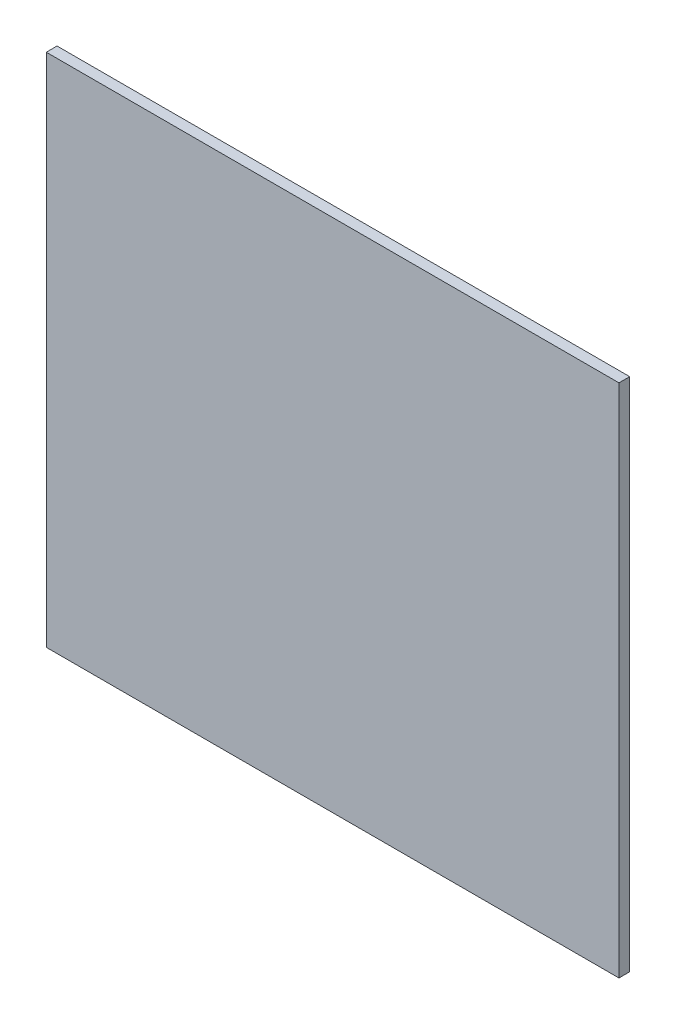
ISO-10303-21;
HEADER;
FILE_DESCRIPTION(('STEP AP214'),'2;1');
FILE_NAME('part.step','',(''),(''),'','','');
FILE_SCHEMA(('AUTOMOTIVE_DESIGN { 1 0 10303 214 1 1 1 1 }'));
ENDSEC;
DATA;
#1=APPLICATION_CONTEXT('core data for automotive mechanical design processes');
#2=APPLICATION_PROTOCOL_DEFINITION('international standard','automotive_design',2000,#1);
#3=PRODUCT_CONTEXT('',#1,'mechanical');
#4=PRODUCT('Part','Part','',(#3));
#5=PRODUCT_RELATED_PRODUCT_CATEGORY('part','',(#4));
#6=PRODUCT_DEFINITION_FORMATION('','',#4);
#7=PRODUCT_DEFINITION_CONTEXT('part definition',#1,'design');
#8=PRODUCT_DEFINITION('design','',#6,#7);
#9=PRODUCT_DEFINITION_SHAPE('','',#8);
#10=(LENGTH_UNIT() NAMED_UNIT(*) SI_UNIT(.MILLI.,.METRE.));
#11=(NAMED_UNIT(*) PLANE_ANGLE_UNIT() SI_UNIT($,.RADIAN.));
#12=(NAMED_UNIT(*) SI_UNIT($,.STERADIAN.) SOLID_ANGLE_UNIT());
#13=UNCERTAINTY_MEASURE_WITH_UNIT(LENGTH_MEASURE(1.E-05),#10,'distance_accuracy_value','');
#14=(GEOMETRIC_REPRESENTATION_CONTEXT(3) GLOBAL_UNCERTAINTY_ASSIGNED_CONTEXT((#13)) GLOBAL_UNIT_ASSIGNED_CONTEXT((#10,
#11,#12)) REPRESENTATION_CONTEXT('',''));
#15=CARTESIAN_POINT('',(0.,0.,0.));
#16=DIRECTION('',(0.,0.,1.));
#17=DIRECTION('',(1.,0.,0.));
#18=AXIS2_PLACEMENT_3D('',#15,#16,#17);
#19=CARTESIAN_POINT('',(0.,914.4,-933.45));
#20=DIRECTION('',(1.,0.,0.));
#21=DIRECTION('',(0.,1.,0.));
#22=AXIS2_PLACEMENT_3D('',#19,#20,#21);
#23=PLANE('',#22);
#24=DIRECTION('',(0.,1.,0.));
#25=VECTOR('',#24,1.);
#26=CARTESIAN_POINT('',(0.,914.4,-914.4));
#27=LINE('',#26,#25);
#28=CARTESIAN_POINT('',(0.,0.,-914.4));
#29=VERTEX_POINT('',#28);
#30=CARTESIAN_POINT('',(0.,914.4,-914.4));
#31=VERTEX_POINT('',#30);
#32=EDGE_CURVE('E96',#29,#31,#27,.T.);
#33=ORIENTED_EDGE('',*,*,#32,.T.);
#34=DIRECTION('',(0.,0.,1.));
#35=VECTOR('',#34,1.);
#36=CARTESIAN_POINT('',(0.,914.4,-933.45));
#37=LINE('',#36,#35);
#38=CARTESIAN_POINT('',(0.,914.4,-933.45));
#39=VERTEX_POINT('',#38);
#40=EDGE_CURVE('E11',#39,#31,#37,.T.);
#41=ORIENTED_EDGE('',*,*,#40,.F.);
#42=DIRECTION('',(0.,1.,0.));
#43=VECTOR('',#42,1.);
#44=CARTESIAN_POINT('',(0.,914.4,-933.45));
#45=LINE('',#44,#43);
#46=CARTESIAN_POINT('',(0.,0.,-933.45));
#47=VERTEX_POINT('',#46);
#48=EDGE_CURVE('E84',#47,#39,#45,.T.);
#49=ORIENTED_EDGE('',*,*,#48,.F.);
#50=DIRECTION('',(0.,0.,1.));
#51=VECTOR('',#50,1.);
#52=CARTESIAN_POINT('',(0.,0.,-933.45));
#53=LINE('',#52,#51);
#54=EDGE_CURVE('E92',#47,#29,#53,.T.);
#55=ORIENTED_EDGE('',*,*,#54,.T.);
#56=EDGE_LOOP('',(#33,#41,#49,#55));
#57=FACE_BOUND('',#56,.T.);
#58=ADVANCED_FACE('F33',(#57),#23,.F.);
#59=CARTESIAN_POINT('',(1016.,914.4,-933.45));
#60=DIRECTION('',(0.,-1.,0.));
#61=DIRECTION('',(0.,0.,-1.));
#62=AXIS2_PLACEMENT_3D('',#59,#60,#61);
#63=PLANE('',#62);
#64=DIRECTION('',(1.,0.,0.));
#65=VECTOR('',#64,1.);
#66=CARTESIAN_POINT('',(1016.,914.4,-914.4));
#67=LINE('',#66,#65);
#68=CARTESIAN_POINT('',(1016.,914.4,-914.4));
#69=VERTEX_POINT('',#68);
#70=EDGE_CURVE('E88',#31,#69,#67,.T.);
#71=ORIENTED_EDGE('',*,*,#70,.T.);
#72=DIRECTION('',(0.,0.,1.));
#73=VECTOR('',#72,1.);
#74=CARTESIAN_POINT('',(1016.,914.4,-933.45));
#75=LINE('',#74,#73);
#76=CARTESIAN_POINT('',(1016.,914.4,-933.45));
#77=VERTEX_POINT('',#76);
#78=EDGE_CURVE('E41',#77,#69,#75,.T.);
#79=ORIENTED_EDGE('',*,*,#78,.F.);
#80=DIRECTION('',(1.,0.,0.));
#81=VECTOR('',#80,1.);
#82=CARTESIAN_POINT('',(1016.,914.4,-933.45));
#83=LINE('',#82,#81);
#84=EDGE_CURVE('E79',#39,#77,#83,.T.);
#85=ORIENTED_EDGE('',*,*,#84,.F.);
#86=ORIENTED_EDGE('',*,*,#40,.T.);
#87=EDGE_LOOP('',(#71,#79,#85,#86));
#88=FACE_BOUND('',#87,.T.);
#89=ADVANCED_FACE('F87',(#88),#63,.F.);
#90=CARTESIAN_POINT('',(1016.,0.,-933.45));
#91=DIRECTION('',(-1.,0.,0.));
#92=DIRECTION('',(0.,0.,1.));
#93=AXIS2_PLACEMENT_3D('',#90,#91,#92);
#94=PLANE('',#93);
#95=DIRECTION('',(0.,-1.,0.));
#96=VECTOR('',#95,1.);
#97=CARTESIAN_POINT('',(1016.,0.,-914.4));
#98=LINE('',#97,#96);
#99=CARTESIAN_POINT('',(1016.,0.,-914.4));
#100=VERTEX_POINT('',#99);
#101=EDGE_CURVE('E66',#69,#100,#98,.T.);
#102=ORIENTED_EDGE('',*,*,#101,.T.);
#103=DIRECTION('',(0.,0.,1.));
#104=VECTOR('',#103,1.);
#105=CARTESIAN_POINT('',(1016.,0.,-933.45));
#106=LINE('',#105,#104);
#107=CARTESIAN_POINT('',(1016.,0.,-933.45));
#108=VERTEX_POINT('',#107);
#109=EDGE_CURVE('E89',#108,#100,#106,.T.);
#110=ORIENTED_EDGE('',*,*,#109,.F.);
#111=DIRECTION('',(0.,-1.,0.));
#112=VECTOR('',#111,1.);
#113=CARTESIAN_POINT('',(1016.,0.,-933.45));
#114=LINE('',#113,#112);
#115=EDGE_CURVE('E82',#77,#108,#114,.T.);
#116=ORIENTED_EDGE('',*,*,#115,.F.);
#117=ORIENTED_EDGE('',*,*,#78,.T.);
#118=EDGE_LOOP('',(#102,#110,#116,#117));
#119=FACE_BOUND('',#118,.T.);
#120=ADVANCED_FACE('F90',(#119),#94,.F.);
#121=CARTESIAN_POINT('',(0.,0.,-933.45));
#122=DIRECTION('',(0.,1.,0.));
#123=DIRECTION('',(0.,0.,1.));
#124=AXIS2_PLACEMENT_3D('',#121,#122,#123);
#125=PLANE('',#124);
#126=DIRECTION('',(-1.,0.,0.));
#127=VECTOR('',#126,1.);
#128=CARTESIAN_POINT('',(0.,0.,-914.4));
#129=LINE('',#128,#127);
#130=EDGE_CURVE('E72',#100,#29,#129,.T.);
#131=ORIENTED_EDGE('',*,*,#130,.T.);
#132=ORIENTED_EDGE('',*,*,#54,.F.);
#133=DIRECTION('',(-1.,0.,0.));
#134=VECTOR('',#133,1.);
#135=CARTESIAN_POINT('',(0.,0.,-933.45));
#136=LINE('',#135,#134);
#137=EDGE_CURVE('E49',#108,#47,#136,.T.);
#138=ORIENTED_EDGE('',*,*,#137,.F.);
#139=ORIENTED_EDGE('',*,*,#109,.T.);
#140=EDGE_LOOP('',(#131,#132,#138,#139));
#141=FACE_BOUND('',#140,.T.);
#142=ADVANCED_FACE('F103',(#141),#125,.F.);
#143=CARTESIAN_POINT('',(0.,0.,-933.45));
#144=DIRECTION('',(0.,0.,1.));
#145=DIRECTION('',(1.,0.,0.));
#146=AXIS2_PLACEMENT_3D('',#143,#144,#145);
#147=PLANE('',#146);
#148=ORIENTED_EDGE('',*,*,#48,.T.);
#149=ORIENTED_EDGE('',*,*,#84,.T.);
#150=ORIENTED_EDGE('',*,*,#115,.T.);
#151=ORIENTED_EDGE('',*,*,#137,.T.);
#152=EDGE_LOOP('',(#148,#149,#150,#151));
#153=FACE_BOUND('',#152,.T.);
#154=ADVANCED_FACE('F80',(#153),#147,.F.);
#155=CARTESIAN_POINT('',(0.,0.,-914.4));
#156=DIRECTION('',(0.,0.,1.));
#157=DIRECTION('',(1.,0.,0.));
#158=AXIS2_PLACEMENT_3D('',#155,#156,#157);
#159=PLANE('',#158);
#160=ORIENTED_EDGE('',*,*,#32,.F.);
#161=ORIENTED_EDGE('',*,*,#130,.F.);
#162=ORIENTED_EDGE('',*,*,#101,.F.);
#163=ORIENTED_EDGE('',*,*,#70,.F.);
#164=EDGE_LOOP('',(#160,#161,#162,#163));
#165=FACE_BOUND('',#164,.T.);
#166=ADVANCED_FACE('F106',(#165),#159,.T.);
#167=CLOSED_SHELL('',(#58,#89,#120,#142,#154,#166));
#168=MANIFOLD_SOLID_BREP('B2',#167);
#169=ADVANCED_BREP_SHAPE_REPRESENTATION('',(#18,#168),#14);
#170=SHAPE_DEFINITION_REPRESENTATION(#9,#169);
ENDSEC;
END-ISO-10303-21;
